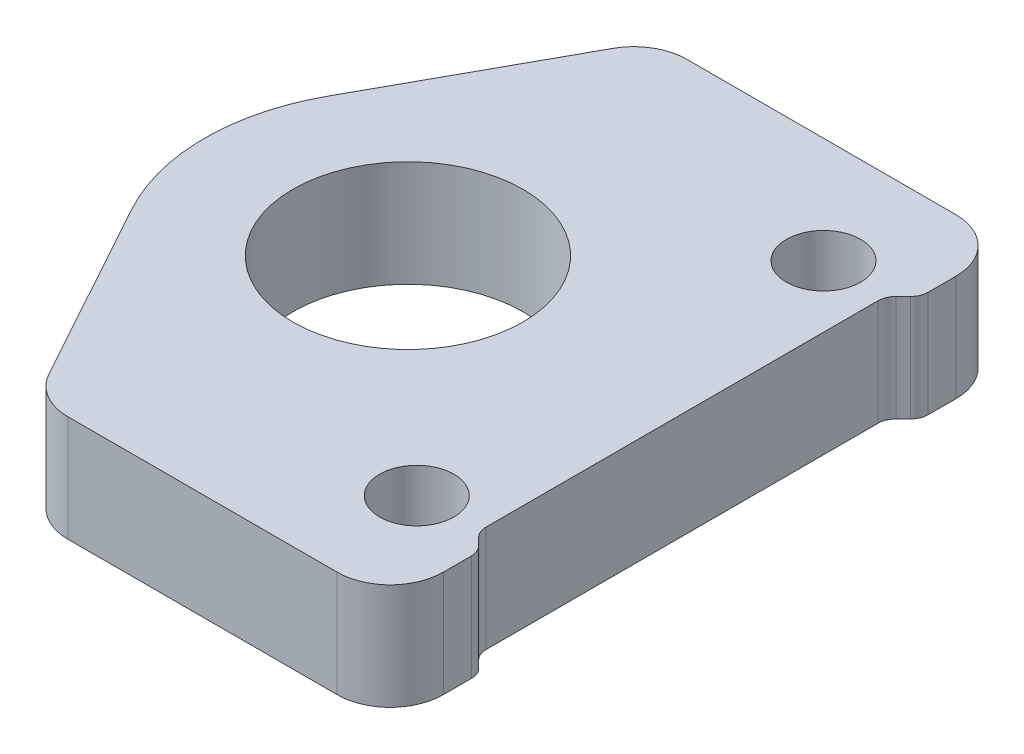
ISO-10303-21;
HEADER;
FILE_DESCRIPTION(('STEP AP214'),'2;1');
FILE_NAME('part.step','',(''),(''),'','','');
FILE_SCHEMA(('AUTOMOTIVE_DESIGN { 1 0 10303 214 1 1 1 1 }'));
ENDSEC;
DATA;
#1=APPLICATION_CONTEXT('core data for automotive mechanical design processes');
#2=APPLICATION_PROTOCOL_DEFINITION('international standard','automotive_design',2000,#1);
#3=PRODUCT_CONTEXT('',#1,'mechanical');
#4=PRODUCT('Part','Part','',(#3));
#5=PRODUCT_RELATED_PRODUCT_CATEGORY('part','',(#4));
#6=PRODUCT_DEFINITION_FORMATION('','',#4);
#7=PRODUCT_DEFINITION_CONTEXT('part definition',#1,'design');
#8=PRODUCT_DEFINITION('design','',#6,#7);
#9=PRODUCT_DEFINITION_SHAPE('','',#8);
#10=(LENGTH_UNIT() NAMED_UNIT(*) SI_UNIT(.MILLI.,.METRE.));
#11=(NAMED_UNIT(*) PLANE_ANGLE_UNIT() SI_UNIT($,.RADIAN.));
#12=(NAMED_UNIT(*) SI_UNIT($,.STERADIAN.) SOLID_ANGLE_UNIT());
#13=UNCERTAINTY_MEASURE_WITH_UNIT(LENGTH_MEASURE(1.E-05),#10,'distance_accuracy_value','');
#14=(GEOMETRIC_REPRESENTATION_CONTEXT(3) GLOBAL_UNCERTAINTY_ASSIGNED_CONTEXT((#13)) GLOBAL_UNIT_ASSIGNED_CONTEXT((#10,
#11,#12)) REPRESENTATION_CONTEXT('',''));
#15=CARTESIAN_POINT('',(0.,0.,0.));
#16=DIRECTION('',(0.,0.,1.));
#17=DIRECTION('',(1.,0.,0.));
#18=AXIS2_PLACEMENT_3D('',#15,#16,#17);
#19=CARTESIAN_POINT('',(0.,6.,0.));
#20=DIRECTION('',(0.,1.,0.));
#21=DIRECTION('',(0.,0.,1.));
#22=AXIS2_PLACEMENT_3D('',#19,#20,#21);
#23=PLANE('',#22);
#24=CARTESIAN_POINT('',(9.5,6.,11.5));
#25=DIRECTION('',(0.,1.,0.));
#26=DIRECTION('',(0.,0.,1.));
#27=AXIS2_PLACEMENT_3D('',#24,#25,#26);
#28=CIRCLE('',#27,2.1);
#29=CARTESIAN_POINT('',(9.5,6.,13.6));
#30=VERTEX_POINT('',#29);
#31=EDGE_CURVE('E241',#30,#30,#28,.T.);
#32=ORIENTED_EDGE('',*,*,#31,.F.);
#33=EDGE_LOOP('',(#32));
#34=FACE_BOUND('',#33,.T.);
#35=CARTESIAN_POINT('',(9.5,6.,-11.5));
#36=DIRECTION('',(0.,1.,0.));
#37=DIRECTION('',(0.,0.,1.));
#38=AXIS2_PLACEMENT_3D('',#35,#36,#37);
#39=CIRCLE('',#38,2.1);
#40=CARTESIAN_POINT('',(9.5,6.,-9.4));
#41=VERTEX_POINT('',#40);
#42=EDGE_CURVE('E247',#41,#41,#39,.T.);
#43=ORIENTED_EDGE('',*,*,#42,.F.);
#44=EDGE_LOOP('',(#43));
#45=FACE_BOUND('',#44,.T.);
#46=CARTESIAN_POINT('',(-2.5,6.,0.));
#47=DIRECTION('',(0.,1.,0.));
#48=DIRECTION('',(0.,0.,1.));
#49=AXIS2_PLACEMENT_3D('',#46,#47,#48);
#50=CIRCLE('',#49,6.505);
#51=CARTESIAN_POINT('',(-2.5,6.,6.505));
#52=VERTEX_POINT('',#51);
#53=EDGE_CURVE('E235',#52,#52,#50,.T.);
#54=ORIENTED_EDGE('',*,*,#53,.F.);
#55=EDGE_LOOP('',(#54));
#56=FACE_BOUND('',#55,.T.);
#57=DIRECTION('',(-1.,0.,0.));
#58=VECTOR('',#57,1.);
#59=CARTESIAN_POINT('',(-14.,6.,-17.5));
#60=LINE('',#59,#58);
#61=CARTESIAN_POINT('',(11.,6.,-17.5));
#62=VERTEX_POINT('',#61);
#63=CARTESIAN_POINT('',(-4.22613682097005,6.,-17.5));
#64=VERTEX_POINT('',#63);
#65=EDGE_CURVE('E255',#62,#64,#60,.T.);
#66=ORIENTED_EDGE('',*,*,#65,.T.);
#67=CARTESIAN_POINT('',(-4.22613682097005,6.,-14.5));
#68=DIRECTION('',(0.,1.,0.));
#69=DIRECTION('',(0.,0.,1.));
#70=AXIS2_PLACEMENT_3D('',#67,#68,#69);
#71=CIRCLE('',#70,3.);
#72=CARTESIAN_POINT('',(-6.85481990843535,6.,-15.9456919539355));
#73=VERTEX_POINT('',#72);
#74=EDGE_CURVE('E188',#64,#73,#71,.T.);
#75=ORIENTED_EDGE('',*,*,#74,.T.);
#76=DIRECTION('',(-0.481897317978503,0.,0.876227695821768));
#77=VECTOR('',#76,1.);
#78=CARTESIAN_POINT('',(-11.9960559392631,6.,-6.59744859814027));
#79=LINE('',#78,#77);
#80=CARTESIAN_POINT('',(-12.5766185019503,6.,-5.5418191567528));
#81=VERTEX_POINT('',#80);
#82=EDGE_CURVE('E183',#73,#81,#79,.T.);
#83=ORIENTED_EDGE('',*,*,#82,.T.);
#84=CARTESIAN_POINT('',(-2.5,6.,0.));
#85=DIRECTION('',(0.,1.,0.));
#86=DIRECTION('',(0.,0.,1.));
#87=AXIS2_PLACEMENT_3D('',#84,#85,#86);
#88=CIRCLE('',#87,11.5);
#89=CARTESIAN_POINT('',(-12.5766185019503,6.,5.5418191567528));
#90=VERTEX_POINT('',#89);
#91=EDGE_CURVE('E187',#81,#90,#88,.T.);
#92=ORIENTED_EDGE('',*,*,#91,.T.);
#93=DIRECTION('',(-0.481897317978504,0.,-0.876227695821768));
#94=VECTOR('',#93,1.);
#95=CARTESIAN_POINT('',(-11.9960559392631,6.,6.59744859814028));
#96=LINE('',#95,#94);
#97=CARTESIAN_POINT('',(-6.85481990843535,6.,15.9456919539355));
#98=VERTEX_POINT('',#97);
#99=EDGE_CURVE('E201',#98,#90,#96,.T.);
#100=ORIENTED_EDGE('',*,*,#99,.F.);
#101=CARTESIAN_POINT('',(-4.22613682097005,6.,14.5));
#102=DIRECTION('',(0.,1.,0.));
#103=DIRECTION('',(0.,0.,1.));
#104=AXIS2_PLACEMENT_3D('',#101,#102,#103);
#105=CIRCLE('',#104,3.);
#106=CARTESIAN_POINT('',(-4.22613682097005,6.,17.5));
#107=VERTEX_POINT('',#106);
#108=EDGE_CURVE('E311',#98,#107,#105,.T.);
#109=ORIENTED_EDGE('',*,*,#108,.T.);
#110=DIRECTION('',(1.,0.,0.));
#111=VECTOR('',#110,1.);
#112=CARTESIAN_POINT('',(-14.,6.,17.5));
#113=LINE('',#112,#111);
#114=CARTESIAN_POINT('',(11.,6.,17.5));
#115=VERTEX_POINT('',#114);
#116=EDGE_CURVE('E258',#107,#115,#113,.T.);
#117=ORIENTED_EDGE('',*,*,#116,.T.);
#118=CARTESIAN_POINT('',(11.,6.,14.5));
#119=DIRECTION('',(0.,1.,0.));
#120=DIRECTION('',(0.,0.,1.));
#121=AXIS2_PLACEMENT_3D('',#118,#119,#120);
#122=CIRCLE('',#121,3.);
#123=CARTESIAN_POINT('',(14.,6.,14.5));
#124=VERTEX_POINT('',#123);
#125=EDGE_CURVE('E313',#115,#124,#122,.T.);
#126=ORIENTED_EDGE('',*,*,#125,.T.);
#127=DIRECTION('',(0.,0.,-1.));
#128=VECTOR('',#127,1.);
#129=CARTESIAN_POINT('',(14.,6.,-17.5));
#130=LINE('',#129,#128);
#131=CARTESIAN_POINT('',(14.,6.,12.9142135623731));
#132=VERTEX_POINT('',#131);
#133=EDGE_CURVE('E253',#124,#132,#130,.T.);
#134=ORIENTED_EDGE('',*,*,#133,.T.);
#135=CARTESIAN_POINT('',(13.,6.,12.9142135623731));
#136=DIRECTION('',(0.,1.,0.));
#137=DIRECTION('',(0.,0.,1.));
#138=AXIS2_PLACEMENT_3D('',#135,#136,#137);
#139=CIRCLE('',#138,1.);
#140=CARTESIAN_POINT('',(13.7071067811866,6.,12.2071067811866));
#141=VERTEX_POINT('',#140);
#142=EDGE_CURVE('E273',#132,#141,#139,.T.);
#143=ORIENTED_EDGE('',*,*,#142,.T.);
#144=DIRECTION('',(0.707106781186546,0.,0.707106781186549));
#145=VECTOR('',#144,1.);
#146=CARTESIAN_POINT('',(13.,6.,11.5));
#147=LINE('',#146,#145);
#148=CARTESIAN_POINT('',(13.2928932188135,6.,11.7928932188135));
#149=VERTEX_POINT('',#148);
#150=EDGE_CURVE('E230',#149,#141,#147,.T.);
#151=ORIENTED_EDGE('',*,*,#150,.F.);
#152=CARTESIAN_POINT('',(14.,6.,11.0857864376269));
#153=DIRECTION('',(0.,1.,0.));
#154=DIRECTION('',(0.,0.,1.));
#155=AXIS2_PLACEMENT_3D('',#152,#153,#154);
#156=CIRCLE('',#155,1.);
#157=CARTESIAN_POINT('',(13.,6.,11.0857864376269));
#158=VERTEX_POINT('',#157);
#159=EDGE_CURVE('E297',#149,#158,#156,.F.);
#160=ORIENTED_EDGE('',*,*,#159,.T.);
#161=DIRECTION('',(0.,0.,1.));
#162=VECTOR('',#161,1.);
#163=CARTESIAN_POINT('',(13.,6.,-11.5));
#164=LINE('',#163,#162);
#165=CARTESIAN_POINT('',(13.,6.,-11.0857864376269));
#166=VERTEX_POINT('',#165);
#167=EDGE_CURVE('E216',#166,#158,#164,.T.);
#168=ORIENTED_EDGE('',*,*,#167,.F.);
#169=CARTESIAN_POINT('',(14.,6.,-11.0857864376269));
#170=DIRECTION('',(0.,1.,0.));
#171=DIRECTION('',(0.,0.,1.));
#172=AXIS2_PLACEMENT_3D('',#169,#170,#171);
#173=CIRCLE('',#172,1.);
#174=CARTESIAN_POINT('',(13.2928932188135,6.,-11.7928932188135));
#175=VERTEX_POINT('',#174);
#176=EDGE_CURVE('E301',#166,#175,#173,.F.);
#177=ORIENTED_EDGE('',*,*,#176,.T.);
#178=DIRECTION('',(-0.707106781186552,0.,0.707106781186543));
#179=VECTOR('',#178,1.);
#180=CARTESIAN_POINT('',(14.,6.,-12.5));
#181=LINE('',#180,#179);
#182=CARTESIAN_POINT('',(13.7071067811865,6.,-12.2071067811865));
#183=VERTEX_POINT('',#182);
#184=EDGE_CURVE('E221',#183,#175,#181,.T.);
#185=ORIENTED_EDGE('',*,*,#184,.F.);
#186=CARTESIAN_POINT('',(13.,6.,-12.9142135623731));
#187=DIRECTION('',(0.,1.,0.));
#188=DIRECTION('',(0.,0.,1.));
#189=AXIS2_PLACEMENT_3D('',#186,#187,#188);
#190=CIRCLE('',#189,1.);
#191=CARTESIAN_POINT('',(14.,6.,-12.9142135623731));
#192=VERTEX_POINT('',#191);
#193=EDGE_CURVE('E271',#183,#192,#190,.T.);
#194=ORIENTED_EDGE('',*,*,#193,.T.);
#195=CARTESIAN_POINT('',(14.,6.,-14.5));
#196=VERTEX_POINT('',#195);
#197=EDGE_CURVE('E256',#192,#196,#130,.T.);
#198=ORIENTED_EDGE('',*,*,#197,.T.);
#199=CARTESIAN_POINT('',(11.,6.,-14.5));
#200=DIRECTION('',(0.,1.,0.));
#201=DIRECTION('',(0.,0.,1.));
#202=AXIS2_PLACEMENT_3D('',#199,#200,#201);
#203=CIRCLE('',#202,3.);
#204=EDGE_CURVE('E315',#196,#62,#203,.T.);
#205=ORIENTED_EDGE('',*,*,#204,.T.);
#206=EDGE_LOOP('',(#66,#75,#83,#92,#100,#109,#117,#126,#134,#143,#151,#160,#168,#177,#185,#194,
#198,#205));
#207=FACE_BOUND('',#206,.T.);
#208=ADVANCED_FACE('F60',(#34,#45,#56,#207),#23,.T.);
#209=CARTESIAN_POINT('',(0.,0.,0.));
#210=DIRECTION('',(0.,1.,0.));
#211=DIRECTION('',(0.,0.,1.));
#212=AXIS2_PLACEMENT_3D('',#209,#210,#211);
#213=PLANE('',#212);
#214=CARTESIAN_POINT('',(9.5,0.,-11.5));
#215=DIRECTION('',(0.,1.,0.));
#216=DIRECTION('',(0.,0.,1.));
#217=AXIS2_PLACEMENT_3D('',#214,#215,#216);
#218=CIRCLE('',#217,2.1);
#219=CARTESIAN_POINT('',(9.5,0.,-9.4));
#220=VERTEX_POINT('',#219);
#221=EDGE_CURVE('E244',#220,#220,#218,.T.);
#222=ORIENTED_EDGE('',*,*,#221,.T.);
#223=EDGE_LOOP('',(#222));
#224=FACE_BOUND('',#223,.T.);
#225=CARTESIAN_POINT('',(9.5,0.,11.5));
#226=DIRECTION('',(0.,1.,0.));
#227=DIRECTION('',(0.,0.,1.));
#228=AXIS2_PLACEMENT_3D('',#225,#226,#227);
#229=CIRCLE('',#228,2.1);
#230=CARTESIAN_POINT('',(9.5,0.,13.6));
#231=VERTEX_POINT('',#230);
#232=EDGE_CURVE('E238',#231,#231,#229,.T.);
#233=ORIENTED_EDGE('',*,*,#232,.T.);
#234=EDGE_LOOP('',(#233));
#235=FACE_BOUND('',#234,.T.);
#236=CARTESIAN_POINT('',(-2.5,0.,0.));
#237=DIRECTION('',(0.,1.,0.));
#238=DIRECTION('',(0.,0.,1.));
#239=AXIS2_PLACEMENT_3D('',#236,#237,#238);
#240=CIRCLE('',#239,6.505);
#241=CARTESIAN_POINT('',(-2.5,0.,6.505));
#242=VERTEX_POINT('',#241);
#243=EDGE_CURVE('E227',#242,#242,#240,.T.);
#244=ORIENTED_EDGE('',*,*,#243,.T.);
#245=EDGE_LOOP('',(#244));
#246=FACE_BOUND('',#245,.T.);
#247=DIRECTION('',(-0.481897317978503,0.,0.876227695821768));
#248=VECTOR('',#247,1.);
#249=CARTESIAN_POINT('',(-11.9960559392631,0.,-6.59744859814027));
#250=LINE('',#249,#248);
#251=CARTESIAN_POINT('',(-6.85481990843535,0.,-15.9456919539355));
#252=VERTEX_POINT('',#251);
#253=CARTESIAN_POINT('',(-12.5766185019503,0.,-5.5418191567528));
#254=VERTEX_POINT('',#253);
#255=EDGE_CURVE('E202',#252,#254,#250,.T.);
#256=ORIENTED_EDGE('',*,*,#255,.F.);
#257=CARTESIAN_POINT('',(-4.22613682097005,0.,-14.5));
#258=DIRECTION('',(0.,1.,0.));
#259=DIRECTION('',(0.,0.,1.));
#260=AXIS2_PLACEMENT_3D('',#257,#258,#259);
#261=CIRCLE('',#260,3.);
#262=CARTESIAN_POINT('',(-4.22613682097005,0.,-17.5));
#263=VERTEX_POINT('',#262);
#264=EDGE_CURVE('E324',#252,#263,#261,.F.);
#265=ORIENTED_EDGE('',*,*,#264,.T.);
#266=DIRECTION('',(-1.,0.,0.));
#267=VECTOR('',#266,1.);
#268=CARTESIAN_POINT('',(-14.,0.,-17.5));
#269=LINE('',#268,#267);
#270=CARTESIAN_POINT('',(11.,0.,-17.5));
#271=VERTEX_POINT('',#270);
#272=EDGE_CURVE('E264',#271,#263,#269,.T.);
#273=ORIENTED_EDGE('',*,*,#272,.F.);
#274=CARTESIAN_POINT('',(11.,0.,-14.5));
#275=DIRECTION('',(0.,1.,0.));
#276=DIRECTION('',(0.,0.,1.));
#277=AXIS2_PLACEMENT_3D('',#274,#275,#276);
#278=CIRCLE('',#277,3.);
#279=CARTESIAN_POINT('',(14.,0.,-14.5));
#280=VERTEX_POINT('',#279);
#281=EDGE_CURVE('E322',#271,#280,#278,.F.);
#282=ORIENTED_EDGE('',*,*,#281,.T.);
#283=DIRECTION('',(0.,0.,-1.));
#284=VECTOR('',#283,1.);
#285=CARTESIAN_POINT('',(14.,0.,-17.5));
#286=LINE('',#285,#284);
#287=CARTESIAN_POINT('',(14.,0.,-12.9142135623731));
#288=VERTEX_POINT('',#287);
#289=EDGE_CURVE('E250',#288,#280,#286,.T.);
#290=ORIENTED_EDGE('',*,*,#289,.F.);
#291=CARTESIAN_POINT('',(13.,0.,-12.9142135623731));
#292=DIRECTION('',(0.,1.,0.));
#293=DIRECTION('',(0.,0.,1.));
#294=AXIS2_PLACEMENT_3D('',#291,#292,#293);
#295=CIRCLE('',#294,1.);
#296=CARTESIAN_POINT('',(13.7071067811865,0.,-12.2071067811865));
#297=VERTEX_POINT('',#296);
#298=EDGE_CURVE('E280',#288,#297,#295,.F.);
#299=ORIENTED_EDGE('',*,*,#298,.T.);
#300=DIRECTION('',(-0.707106781186552,0.,0.707106781186543));
#301=VECTOR('',#300,1.);
#302=CARTESIAN_POINT('',(14.,0.,-12.5));
#303=LINE('',#302,#301);
#304=CARTESIAN_POINT('',(13.2928932188135,0.,-11.7928932188135));
#305=VERTEX_POINT('',#304);
#306=EDGE_CURVE('E224',#297,#305,#303,.T.);
#307=ORIENTED_EDGE('',*,*,#306,.T.);
#308=CARTESIAN_POINT('',(14.,0.,-11.0857864376269));
#309=DIRECTION('',(0.,1.,0.));
#310=DIRECTION('',(0.,0.,1.));
#311=AXIS2_PLACEMENT_3D('',#308,#309,#310);
#312=CIRCLE('',#311,1.);
#313=CARTESIAN_POINT('',(13.,0.,-11.0857864376269));
#314=VERTEX_POINT('',#313);
#315=EDGE_CURVE('E303',#305,#314,#312,.T.);
#316=ORIENTED_EDGE('',*,*,#315,.T.);
#317=DIRECTION('',(0.,0.,1.));
#318=VECTOR('',#317,1.);
#319=CARTESIAN_POINT('',(13.,0.,-11.5));
#320=LINE('',#319,#318);
#321=CARTESIAN_POINT('',(13.,0.,11.0857864376269));
#322=VERTEX_POINT('',#321);
#323=EDGE_CURVE('E217',#314,#322,#320,.T.);
#324=ORIENTED_EDGE('',*,*,#323,.T.);
#325=CARTESIAN_POINT('',(14.,0.,11.0857864376269));
#326=DIRECTION('',(0.,1.,0.));
#327=DIRECTION('',(0.,0.,1.));
#328=AXIS2_PLACEMENT_3D('',#325,#326,#327);
#329=CIRCLE('',#328,1.);
#330=CARTESIAN_POINT('',(13.2928932188135,0.,11.7928932188135));
#331=VERTEX_POINT('',#330);
#332=EDGE_CURVE('E299',#322,#331,#329,.T.);
#333=ORIENTED_EDGE('',*,*,#332,.T.);
#334=DIRECTION('',(0.707106781186546,0.,0.707106781186549));
#335=VECTOR('',#334,1.);
#336=CARTESIAN_POINT('',(13.,0.,11.5));
#337=LINE('',#336,#335);
#338=CARTESIAN_POINT('',(13.7071067811866,0.,12.2071067811866));
#339=VERTEX_POINT('',#338);
#340=EDGE_CURVE('E220',#331,#339,#337,.T.);
#341=ORIENTED_EDGE('',*,*,#340,.T.);
#342=CARTESIAN_POINT('',(13.,0.,12.9142135623731));
#343=DIRECTION('',(0.,1.,0.));
#344=DIRECTION('',(0.,0.,1.));
#345=AXIS2_PLACEMENT_3D('',#342,#343,#344);
#346=CIRCLE('',#345,1.);
#347=CARTESIAN_POINT('',(14.,0.,12.9142135623731));
#348=VERTEX_POINT('',#347);
#349=EDGE_CURVE('E282',#339,#348,#346,.F.);
#350=ORIENTED_EDGE('',*,*,#349,.T.);
#351=CARTESIAN_POINT('',(14.,0.,14.5));
#352=VERTEX_POINT('',#351);
#353=EDGE_CURVE('E262',#352,#348,#286,.T.);
#354=ORIENTED_EDGE('',*,*,#353,.F.);
#355=CARTESIAN_POINT('',(11.,0.,14.5));
#356=DIRECTION('',(0.,1.,0.));
#357=DIRECTION('',(0.,0.,1.));
#358=AXIS2_PLACEMENT_3D('',#355,#356,#357);
#359=CIRCLE('',#358,3.);
#360=CARTESIAN_POINT('',(11.,0.,17.5));
#361=VERTEX_POINT('',#360);
#362=EDGE_CURVE('E81',#352,#361,#359,.F.);
#363=ORIENTED_EDGE('',*,*,#362,.T.);
#364=DIRECTION('',(1.,0.,0.));
#365=VECTOR('',#364,1.);
#366=CARTESIAN_POINT('',(-14.,0.,17.5));
#367=LINE('',#366,#365);
#368=CARTESIAN_POINT('',(-4.22613682097005,0.,17.5));
#369=VERTEX_POINT('',#368);
#370=EDGE_CURVE('E267',#369,#361,#367,.T.);
#371=ORIENTED_EDGE('',*,*,#370,.F.);
#372=CARTESIAN_POINT('',(-4.22613682097005,0.,14.5));
#373=DIRECTION('',(0.,1.,0.));
#374=DIRECTION('',(0.,0.,1.));
#375=AXIS2_PLACEMENT_3D('',#372,#373,#374);
#376=CIRCLE('',#375,3.);
#377=CARTESIAN_POINT('',(-6.85481990843535,0.,15.9456919539355));
#378=VERTEX_POINT('',#377);
#379=EDGE_CURVE('E75',#369,#378,#376,.F.);
#380=ORIENTED_EDGE('',*,*,#379,.T.);
#381=DIRECTION('',(-0.481897317978504,0.,-0.876227695821768));
#382=VECTOR('',#381,1.);
#383=CARTESIAN_POINT('',(-11.9960559392631,0.,6.59744859814028));
#384=LINE('',#383,#382);
#385=CARTESIAN_POINT('',(-12.5766185019503,0.,5.5418191567528));
#386=VERTEX_POINT('',#385);
#387=EDGE_CURVE('E212',#378,#386,#384,.T.);
#388=ORIENTED_EDGE('',*,*,#387,.T.);
#389=CARTESIAN_POINT('',(-2.5,0.,0.));
#390=DIRECTION('',(0.,1.,0.));
#391=DIRECTION('',(0.,0.,1.));
#392=AXIS2_PLACEMENT_3D('',#389,#390,#391);
#393=CIRCLE('',#392,11.5);
#394=EDGE_CURVE('E214',#254,#386,#393,.T.);
#395=ORIENTED_EDGE('',*,*,#394,.F.);
#396=EDGE_LOOP('',(#256,#265,#273,#282,#290,#299,#307,#316,#324,#333,#341,#350,#354,#363,#371,
#380,#388,#395));
#397=FACE_BOUND('',#396,.T.);
#398=ADVANCED_FACE('F346',(#224,#235,#246,#397),#213,.F.);
#399=CARTESIAN_POINT('',(-14.,6.,-17.5));
#400=DIRECTION('',(0.,0.,1.));
#401=DIRECTION('',(1.,0.,0.));
#402=AXIS2_PLACEMENT_3D('',#399,#400,#401);
#403=PLANE('',#402);
#404=ORIENTED_EDGE('',*,*,#272,.T.);
#405=DIRECTION('',(0.,1.,0.));
#406=VECTOR('',#405,1.);
#407=CARTESIAN_POINT('',(-4.22613682097005,6.,-17.5));
#408=LINE('',#407,#406);
#409=EDGE_CURVE('E308',#263,#64,#408,.T.);
#410=ORIENTED_EDGE('',*,*,#409,.T.);
#411=ORIENTED_EDGE('',*,*,#65,.F.);
#412=DIRECTION('',(0.,-1.,0.));
#413=VECTOR('',#412,1.);
#414=CARTESIAN_POINT('',(11.,6.,-17.5));
#415=LINE('',#414,#413);
#416=EDGE_CURVE('E305',#62,#271,#415,.T.);
#417=ORIENTED_EDGE('',*,*,#416,.T.);
#418=EDGE_LOOP('',(#404,#410,#411,#417));
#419=FACE_BOUND('',#418,.T.);
#420=ADVANCED_FACE('F393',(#419),#403,.F.);
#421=CARTESIAN_POINT('',(14.,6.,-17.5));
#422=DIRECTION('',(-1.,0.,0.));
#423=DIRECTION('',(0.,0.,1.));
#424=AXIS2_PLACEMENT_3D('',#421,#422,#423);
#425=PLANE('',#424);
#426=ORIENTED_EDGE('',*,*,#289,.T.);
#427=DIRECTION('',(0.,-1.,0.));
#428=VECTOR('',#427,1.);
#429=CARTESIAN_POINT('',(14.,6.,-14.5));
#430=LINE('',#429,#428);
#431=EDGE_CURVE('E326',#280,#196,#430,.F.);
#432=ORIENTED_EDGE('',*,*,#431,.T.);
#433=ORIENTED_EDGE('',*,*,#197,.F.);
#434=DIRECTION('',(0.,1.,0.));
#435=VECTOR('',#434,1.);
#436=CARTESIAN_POINT('',(14.,6.,-12.9142135623731));
#437=LINE('',#436,#435);
#438=EDGE_CURVE('E295',#192,#288,#437,.F.);
#439=ORIENTED_EDGE('',*,*,#438,.T.);
#440=EDGE_LOOP('',(#426,#432,#433,#439));
#441=FACE_BOUND('',#440,.T.);
#442=ADVANCED_FACE('F385',(#441),#425,.F.);
#443=ORIENTED_EDGE('',*,*,#133,.F.);
#444=DIRECTION('',(0.,-1.,0.));
#445=VECTOR('',#444,1.);
#446=CARTESIAN_POINT('',(14.,6.,14.5));
#447=LINE('',#446,#445);
#448=EDGE_CURVE('E328',#124,#352,#447,.T.);
#449=ORIENTED_EDGE('',*,*,#448,.T.);
#450=ORIENTED_EDGE('',*,*,#353,.T.);
#451=DIRECTION('',(0.,1.,0.));
#452=VECTOR('',#451,1.);
#453=CARTESIAN_POINT('',(14.,6.,12.9142135623731));
#454=LINE('',#453,#452);
#455=EDGE_CURVE('E261',#348,#132,#454,.T.);
#456=ORIENTED_EDGE('',*,*,#455,.T.);
#457=EDGE_LOOP('',(#443,#449,#450,#456));
#458=FACE_BOUND('',#457,.T.);
#459=ADVANCED_FACE('F345',(#458),#425,.F.);
#460=CARTESIAN_POINT('',(-14.,6.,17.5));
#461=DIRECTION('',(0.,0.,-1.));
#462=DIRECTION('',(-1.,0.,0.));
#463=AXIS2_PLACEMENT_3D('',#460,#461,#462);
#464=PLANE('',#463);
#465=ORIENTED_EDGE('',*,*,#370,.T.);
#466=DIRECTION('',(0.,-1.,0.));
#467=VECTOR('',#466,1.);
#468=CARTESIAN_POINT('',(11.,6.,17.5));
#469=LINE('',#468,#467);
#470=EDGE_CURVE('E68',#361,#115,#469,.F.);
#471=ORIENTED_EDGE('',*,*,#470,.T.);
#472=ORIENTED_EDGE('',*,*,#116,.F.);
#473=DIRECTION('',(0.,-1.,0.));
#474=VECTOR('',#473,1.);
#475=CARTESIAN_POINT('',(-4.22613682097005,6.,17.5));
#476=LINE('',#475,#474);
#477=EDGE_CURVE('E331',#107,#369,#476,.T.);
#478=ORIENTED_EDGE('',*,*,#477,.T.);
#479=EDGE_LOOP('',(#465,#471,#472,#478));
#480=FACE_BOUND('',#479,.T.);
#481=ADVANCED_FACE('F336',(#480),#464,.F.);
#482=CARTESIAN_POINT('',(9.5,6.,-11.5));
#483=DIRECTION('',(0.,-1.,0.));
#484=DIRECTION('',(0.,0.,-1.));
#485=AXIS2_PLACEMENT_3D('',#482,#483,#484);
#486=CYLINDRICAL_SURFACE('',#485,2.1);
#487=ORIENTED_EDGE('',*,*,#42,.T.);
#488=EDGE_LOOP('',(#487));
#489=FACE_BOUND('',#488,.T.);
#490=ORIENTED_EDGE('',*,*,#221,.F.);
#491=EDGE_LOOP('',(#490));
#492=FACE_BOUND('',#491,.T.);
#493=ADVANCED_FACE('F418',(#489,#492),#486,.F.);
#494=CARTESIAN_POINT('',(9.5,6.,11.5));
#495=DIRECTION('',(0.,-1.,0.));
#496=DIRECTION('',(0.,0.,-1.));
#497=AXIS2_PLACEMENT_3D('',#494,#495,#496);
#498=CYLINDRICAL_SURFACE('',#497,2.1);
#499=ORIENTED_EDGE('',*,*,#31,.T.);
#500=EDGE_LOOP('',(#499));
#501=FACE_BOUND('',#500,.T.);
#502=ORIENTED_EDGE('',*,*,#232,.F.);
#503=EDGE_LOOP('',(#502));
#504=FACE_BOUND('',#503,.T.);
#505=ADVANCED_FACE('F531',(#501,#504),#498,.F.);
#506=CARTESIAN_POINT('',(-2.5,6.,0.));
#507=DIRECTION('',(0.,-1.,0.));
#508=DIRECTION('',(0.,0.,-1.));
#509=AXIS2_PLACEMENT_3D('',#506,#507,#508);
#510=CYLINDRICAL_SURFACE('',#509,6.505);
#511=ORIENTED_EDGE('',*,*,#53,.T.);
#512=EDGE_LOOP('',(#511));
#513=FACE_BOUND('',#512,.T.);
#514=ORIENTED_EDGE('',*,*,#243,.F.);
#515=EDGE_LOOP('',(#514));
#516=FACE_BOUND('',#515,.T.);
#517=ADVANCED_FACE('F537',(#513,#516),#510,.F.);
#518=CARTESIAN_POINT('',(13.,0.,-11.5));
#519=DIRECTION('',(-1.,0.,0.));
#520=DIRECTION('',(0.,0.,1.));
#521=AXIS2_PLACEMENT_3D('',#518,#519,#520);
#522=PLANE('',#521);
#523=ORIENTED_EDGE('',*,*,#167,.T.);
#524=DIRECTION('',(0.,1.,0.));
#525=VECTOR('',#524,1.);
#526=CARTESIAN_POINT('',(13.,0.,11.0857864376269));
#527=LINE('',#526,#525);
#528=EDGE_CURVE('E288',#158,#322,#527,.F.);
#529=ORIENTED_EDGE('',*,*,#528,.T.);
#530=ORIENTED_EDGE('',*,*,#323,.F.);
#531=DIRECTION('',(0.,1.,0.));
#532=VECTOR('',#531,1.);
#533=CARTESIAN_POINT('',(13.,6.,-11.0857864376269));
#534=LINE('',#533,#532);
#535=EDGE_CURVE('E285',#314,#166,#534,.T.);
#536=ORIENTED_EDGE('',*,*,#535,.T.);
#537=EDGE_LOOP('',(#523,#529,#530,#536));
#538=FACE_BOUND('',#537,.T.);
#539=ADVANCED_FACE('F364',(#538),#522,.F.);
#540=CARTESIAN_POINT('',(14.,0.,-12.5));
#541=DIRECTION('',(-0.707106781186543,0.,-0.707106781186552));
#542=DIRECTION('',(-0.707106781186552,0.,0.707106781186543));
#543=AXIS2_PLACEMENT_3D('',#540,#541,#542);
#544=PLANE('',#543);
#545=ORIENTED_EDGE('',*,*,#306,.F.);
#546=DIRECTION('',(0.,1.,0.));
#547=VECTOR('',#546,1.);
#548=CARTESIAN_POINT('',(13.7071067811865,0.,-12.2071067811865));
#549=LINE('',#548,#547);
#550=EDGE_CURVE('E292',#297,#183,#549,.T.);
#551=ORIENTED_EDGE('',*,*,#550,.T.);
#552=ORIENTED_EDGE('',*,*,#184,.T.);
#553=DIRECTION('',(0.,1.,0.));
#554=VECTOR('',#553,1.);
#555=CARTESIAN_POINT('',(13.2928932188135,0.,-11.7928932188135));
#556=LINE('',#555,#554);
#557=EDGE_CURVE('E290',#175,#305,#556,.F.);
#558=ORIENTED_EDGE('',*,*,#557,.T.);
#559=EDGE_LOOP('',(#545,#551,#552,#558));
#560=FACE_BOUND('',#559,.T.);
#561=ADVANCED_FACE('F374',(#560),#544,.F.);
#562=CARTESIAN_POINT('',(13.,0.,11.5));
#563=DIRECTION('',(-0.707106781186549,0.,0.707106781186546));
#564=DIRECTION('',(0.707106781186546,0.,0.707106781186549));
#565=AXIS2_PLACEMENT_3D('',#562,#563,#564);
#566=PLANE('',#565);
#567=ORIENTED_EDGE('',*,*,#150,.T.);
#568=DIRECTION('',(0.,1.,0.));
#569=VECTOR('',#568,1.);
#570=CARTESIAN_POINT('',(13.7071067811866,0.,12.2071067811866));
#571=LINE('',#570,#569);
#572=EDGE_CURVE('E278',#141,#339,#571,.F.);
#573=ORIENTED_EDGE('',*,*,#572,.T.);
#574=ORIENTED_EDGE('',*,*,#340,.F.);
#575=DIRECTION('',(0.,1.,0.));
#576=VECTOR('',#575,1.);
#577=CARTESIAN_POINT('',(13.2928932188135,6.,11.7928932188135));
#578=LINE('',#577,#576);
#579=EDGE_CURVE('E275',#331,#149,#578,.T.);
#580=ORIENTED_EDGE('',*,*,#579,.T.);
#581=EDGE_LOOP('',(#567,#573,#574,#580));
#582=FACE_BOUND('',#581,.T.);
#583=ADVANCED_FACE('F356',(#582),#566,.F.);
#584=CARTESIAN_POINT('',(13.,6.,12.9142135623731));
#585=DIRECTION('',(0.,1.,0.));
#586=DIRECTION('',(0.,0.,1.));
#587=AXIS2_PLACEMENT_3D('',#584,#585,#586);
#588=CYLINDRICAL_SURFACE('',#587,1.);
#589=ORIENTED_EDGE('',*,*,#349,.F.);
#590=ORIENTED_EDGE('',*,*,#572,.F.);
#591=ORIENTED_EDGE('',*,*,#142,.F.);
#592=ORIENTED_EDGE('',*,*,#455,.F.);
#593=EDGE_LOOP('',(#589,#590,#591,#592));
#594=FACE_BOUND('',#593,.T.);
#595=ADVANCED_FACE('F353',(#594),#588,.T.);
#596=CARTESIAN_POINT('',(14.,0.,11.0857864376269));
#597=DIRECTION('',(0.,-1.,0.));
#598=DIRECTION('',(0.,0.,-1.));
#599=AXIS2_PLACEMENT_3D('',#596,#597,#598);
#600=CYLINDRICAL_SURFACE('',#599,1.);
#601=ORIENTED_EDGE('',*,*,#332,.F.);
#602=ORIENTED_EDGE('',*,*,#528,.F.);
#603=ORIENTED_EDGE('',*,*,#159,.F.);
#604=ORIENTED_EDGE('',*,*,#579,.F.);
#605=EDGE_LOOP('',(#601,#602,#603,#604));
#606=FACE_BOUND('',#605,.T.);
#607=ADVANCED_FACE('F360',(#606),#600,.F.);
#608=CARTESIAN_POINT('',(13.,0.,-12.9142135623731));
#609=DIRECTION('',(0.,1.,0.));
#610=DIRECTION('',(0.,0.,1.));
#611=AXIS2_PLACEMENT_3D('',#608,#609,#610);
#612=CYLINDRICAL_SURFACE('',#611,1.);
#613=ORIENTED_EDGE('',*,*,#298,.F.);
#614=ORIENTED_EDGE('',*,*,#438,.F.);
#615=ORIENTED_EDGE('',*,*,#193,.F.);
#616=ORIENTED_EDGE('',*,*,#550,.F.);
#617=EDGE_LOOP('',(#613,#614,#615,#616));
#618=FACE_BOUND('',#617,.T.);
#619=ADVANCED_FACE('F378',(#618),#612,.T.);
#620=CARTESIAN_POINT('',(14.,0.,-11.0857864376269));
#621=DIRECTION('',(0.,-1.,0.));
#622=DIRECTION('',(0.,0.,-1.));
#623=AXIS2_PLACEMENT_3D('',#620,#621,#622);
#624=CYLINDRICAL_SURFACE('',#623,1.);
#625=ORIENTED_EDGE('',*,*,#315,.F.);
#626=ORIENTED_EDGE('',*,*,#557,.F.);
#627=ORIENTED_EDGE('',*,*,#176,.F.);
#628=ORIENTED_EDGE('',*,*,#535,.F.);
#629=EDGE_LOOP('',(#625,#626,#627,#628));
#630=FACE_BOUND('',#629,.T.);
#631=ADVANCED_FACE('F369',(#630),#624,.F.);
#632=CARTESIAN_POINT('',(-2.5,-4.,0.));
#633=DIRECTION('',(0.,1.,0.));
#634=DIRECTION('',(0.,0.,1.));
#635=AXIS2_PLACEMENT_3D('',#632,#633,#634);
#636=CYLINDRICAL_SURFACE('',#635,11.5);
#637=ORIENTED_EDGE('',*,*,#394,.T.);
#638=DIRECTION('',(0.,1.,0.));
#639=VECTOR('',#638,1.);
#640=CARTESIAN_POINT('',(-12.5766185019503,-4.,5.5418191567528));
#641=LINE('',#640,#639);
#642=EDGE_CURVE('E200',#386,#90,#641,.T.);
#643=ORIENTED_EDGE('',*,*,#642,.T.);
#644=ORIENTED_EDGE('',*,*,#91,.F.);
#645=DIRECTION('',(0.,1.,0.));
#646=VECTOR('',#645,1.);
#647=CARTESIAN_POINT('',(-12.5766185019503,-4.,-5.5418191567528));
#648=LINE('',#647,#646);
#649=EDGE_CURVE('E192',#254,#81,#648,.T.);
#650=ORIENTED_EDGE('',*,*,#649,.F.);
#651=EDGE_LOOP('',(#637,#643,#644,#650));
#652=FACE_BOUND('',#651,.T.);
#653=ADVANCED_FACE('F198',(#652),#636,.T.);
#654=CARTESIAN_POINT('',(-11.9960559392631,-4.,6.59744859814028));
#655=DIRECTION('',(0.876227695821768,0.,-0.481897317978504));
#656=DIRECTION('',(-0.481897317978504,0.,-0.876227695821768));
#657=AXIS2_PLACEMENT_3D('',#654,#655,#656);
#658=PLANE('',#657);
#659=ORIENTED_EDGE('',*,*,#387,.F.);
#660=DIRECTION('',(0.,-1.,0.));
#661=VECTOR('',#660,1.);
#662=CARTESIAN_POINT('',(-6.85481990843535,-4.,15.9456919539355));
#663=LINE('',#662,#661);
#664=EDGE_CURVE('E12',#378,#98,#663,.F.);
#665=ORIENTED_EDGE('',*,*,#664,.T.);
#666=ORIENTED_EDGE('',*,*,#99,.T.);
#667=ORIENTED_EDGE('',*,*,#642,.F.);
#668=EDGE_LOOP('',(#659,#665,#666,#667));
#669=FACE_BOUND('',#668,.T.);
#670=ADVANCED_FACE('F400',(#669),#658,.F.);
#671=CARTESIAN_POINT('',(-11.9960559392631,-4.,-6.59744859814027));
#672=DIRECTION('',(-0.876227695821768,0.,-0.481897317978503));
#673=DIRECTION('',(-0.481897317978503,0.,0.876227695821768));
#674=AXIS2_PLACEMENT_3D('',#671,#672,#673);
#675=PLANE('',#674);
#676=ORIENTED_EDGE('',*,*,#82,.F.);
#677=DIRECTION('',(0.,1.,0.));
#678=VECTOR('',#677,1.);
#679=CARTESIAN_POINT('',(-6.85481990843535,0.,-15.9456919539355));
#680=LINE('',#679,#678);
#681=EDGE_CURVE('E318',#73,#252,#680,.F.);
#682=ORIENTED_EDGE('',*,*,#681,.T.);
#683=ORIENTED_EDGE('',*,*,#255,.T.);
#684=ORIENTED_EDGE('',*,*,#649,.T.);
#685=EDGE_LOOP('',(#676,#682,#683,#684));
#686=FACE_BOUND('',#685,.T.);
#687=ADVANCED_FACE('F204',(#686),#675,.T.);
#688=CARTESIAN_POINT('',(-4.22613682097005,6.,-14.5));
#689=DIRECTION('',(0.,-1.,0.));
#690=DIRECTION('',(0.,0.,-1.));
#691=AXIS2_PLACEMENT_3D('',#688,#689,#690);
#692=CYLINDRICAL_SURFACE('',#691,3.);
#693=ORIENTED_EDGE('',*,*,#264,.F.);
#694=ORIENTED_EDGE('',*,*,#681,.F.);
#695=ORIENTED_EDGE('',*,*,#74,.F.);
#696=ORIENTED_EDGE('',*,*,#409,.F.);
#697=EDGE_LOOP('',(#693,#694,#695,#696));
#698=FACE_BOUND('',#697,.T.);
#699=ADVANCED_FACE('F398',(#698),#692,.T.);
#700=CARTESIAN_POINT('',(11.,6.,-14.5));
#701=DIRECTION('',(0.,-1.,0.));
#702=DIRECTION('',(0.,0.,-1.));
#703=AXIS2_PLACEMENT_3D('',#700,#701,#702);
#704=CYLINDRICAL_SURFACE('',#703,3.);
#705=ORIENTED_EDGE('',*,*,#204,.F.);
#706=ORIENTED_EDGE('',*,*,#431,.F.);
#707=ORIENTED_EDGE('',*,*,#281,.F.);
#708=ORIENTED_EDGE('',*,*,#416,.F.);
#709=EDGE_LOOP('',(#705,#706,#707,#708));
#710=FACE_BOUND('',#709,.T.);
#711=ADVANCED_FACE('F389',(#710),#704,.T.);
#712=CARTESIAN_POINT('',(11.,6.,14.5));
#713=DIRECTION('',(0.,-1.,0.));
#714=DIRECTION('',(0.,0.,-1.));
#715=AXIS2_PLACEMENT_3D('',#712,#713,#714);
#716=CYLINDRICAL_SURFACE('',#715,3.);
#717=ORIENTED_EDGE('',*,*,#125,.F.);
#718=ORIENTED_EDGE('',*,*,#470,.F.);
#719=ORIENTED_EDGE('',*,*,#362,.F.);
#720=ORIENTED_EDGE('',*,*,#448,.F.);
#721=EDGE_LOOP('',(#717,#718,#719,#720));
#722=FACE_BOUND('',#721,.T.);
#723=ADVANCED_FACE('F343',(#722),#716,.T.);
#724=CARTESIAN_POINT('',(-4.22613682097005,6.,14.5));
#725=DIRECTION('',(0.,-1.,0.));
#726=DIRECTION('',(0.,0.,-1.));
#727=AXIS2_PLACEMENT_3D('',#724,#725,#726);
#728=CYLINDRICAL_SURFACE('',#727,3.);
#729=ORIENTED_EDGE('',*,*,#108,.F.);
#730=ORIENTED_EDGE('',*,*,#664,.F.);
#731=ORIENTED_EDGE('',*,*,#379,.F.);
#732=ORIENTED_EDGE('',*,*,#477,.F.);
#733=EDGE_LOOP('',(#729,#730,#731,#732));
#734=FACE_BOUND('',#733,.T.);
#735=ADVANCED_FACE('F62',(#734),#728,.T.);
#736=CLOSED_SHELL('',(#208,#398,#420,#442,#459,#481,#493,#505,#517,#539,#561,#583,#595,#607,
#619,#631,#653,#670,#687,#699,#711,#723,#735));
#737=MANIFOLD_SOLID_BREP('B2',#736);
#738=ADVANCED_BREP_SHAPE_REPRESENTATION('',(#18,#737),#14);
#739=SHAPE_DEFINITION_REPRESENTATION(#9,#738);
ENDSEC;
END-ISO-10303-21;
